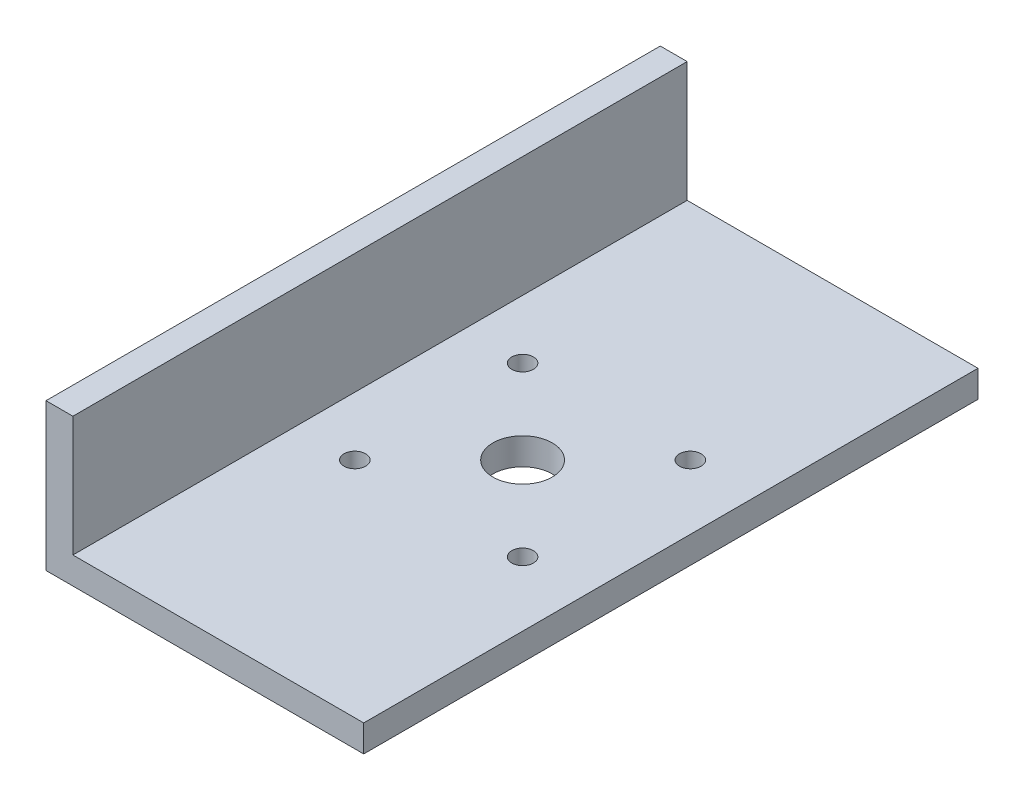
ISO-10303-21;
HEADER;
FILE_DESCRIPTION(('STEP AP214'),'2;1');
FILE_NAME('part.step','',(''),(''),'','','');
FILE_SCHEMA(('AUTOMOTIVE_DESIGN { 1 0 10303 214 1 1 1 1 }'));
ENDSEC;
DATA;
#1=APPLICATION_CONTEXT('core data for automotive mechanical design processes');
#2=APPLICATION_PROTOCOL_DEFINITION('international standard','automotive_design',2000,#1);
#3=PRODUCT_CONTEXT('',#1,'mechanical');
#4=PRODUCT('Part','Part','',(#3));
#5=PRODUCT_RELATED_PRODUCT_CATEGORY('part','',(#4));
#6=PRODUCT_DEFINITION_FORMATION('','',#4);
#7=PRODUCT_DEFINITION_CONTEXT('part definition',#1,'design');
#8=PRODUCT_DEFINITION('design','',#6,#7);
#9=PRODUCT_DEFINITION_SHAPE('','',#8);
#10=(LENGTH_UNIT() NAMED_UNIT(*) SI_UNIT(.MILLI.,.METRE.));
#11=(NAMED_UNIT(*) PLANE_ANGLE_UNIT() SI_UNIT($,.RADIAN.));
#12=(NAMED_UNIT(*) SI_UNIT($,.STERADIAN.) SOLID_ANGLE_UNIT());
#13=UNCERTAINTY_MEASURE_WITH_UNIT(LENGTH_MEASURE(1.E-05),#10,'distance_accuracy_value','');
#14=(GEOMETRIC_REPRESENTATION_CONTEXT(3) GLOBAL_UNCERTAINTY_ASSIGNED_CONTEXT((#13)) GLOBAL_UNIT_ASSIGNED_CONTEXT((#10,
#11,#12)) REPRESENTATION_CONTEXT('',''));
#15=CARTESIAN_POINT('',(0.,0.,0.));
#16=DIRECTION('',(0.,0.,1.));
#17=DIRECTION('',(1.,0.,0.));
#18=AXIS2_PLACEMENT_3D('',#15,#16,#17);
#19=CARTESIAN_POINT('',(75.,-37.5,145.));
#20=DIRECTION('',(0.,1.,0.));
#21=DIRECTION('',(0.,0.,1.));
#22=AXIS2_PLACEMENT_3D('',#19,#20,#21);
#23=PLANE('',#22);
#24=CARTESIAN_POINT('',(20.2010101267767,-37.5,52.7010101267767));
#25=DIRECTION('',(0.,1.,0.));
#26=DIRECTION('',(0.,0.,1.));
#27=AXIS2_PLACEMENT_3D('',#24,#25,#26);
#28=CIRCLE('',#27,2.54999999999999);
#29=CARTESIAN_POINT('',(20.2010101267767,-37.5,55.2510101267767));
#30=VERTEX_POINT('',#29);
#31=EDGE_CURVE('E163',#30,#30,#28,.T.);
#32=ORIENTED_EDGE('',*,*,#31,.T.);
#33=EDGE_LOOP('',(#32));
#34=FACE_BOUND('',#33,.T.);
#35=CARTESIAN_POINT('',(20.2010101267767,-37.5,92.2989898732233));
#36=DIRECTION('',(0.,1.,0.));
#37=DIRECTION('',(0.,0.,1.));
#38=AXIS2_PLACEMENT_3D('',#35,#36,#37);
#39=CIRCLE('',#38,2.54999999999999);
#40=CARTESIAN_POINT('',(20.2010101267767,-37.5,94.8489898732233));
#41=VERTEX_POINT('',#40);
#42=EDGE_CURVE('E169',#41,#41,#39,.T.);
#43=ORIENTED_EDGE('',*,*,#42,.T.);
#44=EDGE_LOOP('',(#43));
#45=FACE_BOUND('',#44,.T.);
#46=CARTESIAN_POINT('',(59.7989898732233,-37.5,92.2989898732233));
#47=DIRECTION('',(0.,1.,0.));
#48=DIRECTION('',(0.,0.,1.));
#49=AXIS2_PLACEMENT_3D('',#46,#47,#48);
#50=CIRCLE('',#49,2.55);
#51=CARTESIAN_POINT('',(59.7989898732233,-37.5,94.8489898732233));
#52=VERTEX_POINT('',#51);
#53=EDGE_CURVE('E175',#52,#52,#50,.T.);
#54=ORIENTED_EDGE('',*,*,#53,.T.);
#55=EDGE_LOOP('',(#54));
#56=FACE_BOUND('',#55,.T.);
#57=CARTESIAN_POINT('',(59.7989898732233,-37.5,52.7010101267767));
#58=DIRECTION('',(0.,1.,0.));
#59=DIRECTION('',(0.,0.,1.));
#60=AXIS2_PLACEMENT_3D('',#57,#58,#59);
#61=CIRCLE('',#60,2.55);
#62=CARTESIAN_POINT('',(59.7989898732233,-37.5,55.2510101267767));
#63=VERTEX_POINT('',#62);
#64=EDGE_CURVE('E140',#63,#63,#61,.T.);
#65=ORIENTED_EDGE('',*,*,#64,.T.);
#66=EDGE_LOOP('',(#65));
#67=FACE_BOUND('',#66,.T.);
#68=CARTESIAN_POINT('',(40.,-37.5,72.5));
#69=DIRECTION('',(0.,-1.,0.));
#70=DIRECTION('',(0.,0.,-1.));
#71=AXIS2_PLACEMENT_3D('',#68,#69,#70);
#72=CIRCLE('',#71,7.);
#73=CARTESIAN_POINT('',(40.,-37.5,65.5));
#74=VERTEX_POINT('',#73);
#75=EDGE_CURVE('E136',#74,#74,#72,.T.);
#76=ORIENTED_EDGE('',*,*,#75,.F.);
#77=EDGE_LOOP('',(#76));
#78=FACE_BOUND('',#77,.T.);
#79=DIRECTION('',(1.,0.,0.));
#80=VECTOR('',#79,1.);
#81=CARTESIAN_POINT('',(75.,-37.5,0.));
#82=LINE('',#81,#80);
#83=CARTESIAN_POINT('',(0.,-37.5,0.));
#84=VERTEX_POINT('',#83);
#85=CARTESIAN_POINT('',(75.,-37.5,0.));
#86=VERTEX_POINT('',#85);
#87=EDGE_CURVE('E118',#84,#86,#82,.T.);
#88=ORIENTED_EDGE('',*,*,#87,.T.);
#89=DIRECTION('',(0.,0.,-1.));
#90=VECTOR('',#89,1.);
#91=CARTESIAN_POINT('',(75.,-37.5,145.));
#92=LINE('',#91,#90);
#93=CARTESIAN_POINT('',(75.,-37.5,145.));
#94=VERTEX_POINT('',#93);
#95=EDGE_CURVE('E41',#94,#86,#92,.T.);
#96=ORIENTED_EDGE('',*,*,#95,.F.);
#97=DIRECTION('',(1.,0.,0.));
#98=VECTOR('',#97,1.);
#99=CARTESIAN_POINT('',(75.,-37.5,145.));
#100=LINE('',#99,#98);
#101=CARTESIAN_POINT('',(0.,-37.5,145.));
#102=VERTEX_POINT('',#101);
#103=EDGE_CURVE('E128',#102,#94,#100,.T.);
#104=ORIENTED_EDGE('',*,*,#103,.F.);
#105=DIRECTION('',(0.,0.,-1.));
#106=VECTOR('',#105,1.);
#107=CARTESIAN_POINT('',(0.,-37.5,145.));
#108=LINE('',#107,#106);
#109=EDGE_CURVE('E113',#102,#84,#108,.T.);
#110=ORIENTED_EDGE('',*,*,#109,.T.);
#111=EDGE_LOOP('',(#88,#96,#104,#110));
#112=FACE_BOUND('',#111,.T.);
#113=ADVANCED_FACE('F34',(#34,#45,#56,#67,#78,#112),#23,.F.);
#114=CARTESIAN_POINT('',(75.,-31.15,145.));
#115=DIRECTION('',(-1.,0.,0.));
#116=DIRECTION('',(0.,-1.,0.));
#117=AXIS2_PLACEMENT_3D('',#114,#115,#116);
#118=PLANE('',#117);
#119=DIRECTION('',(0.,1.,0.));
#120=VECTOR('',#119,1.);
#121=CARTESIAN_POINT('',(75.,-31.15,0.));
#122=LINE('',#121,#120);
#123=CARTESIAN_POINT('',(75.,-31.15,0.));
#124=VERTEX_POINT('',#123);
#125=EDGE_CURVE('E121',#86,#124,#122,.T.);
#126=ORIENTED_EDGE('',*,*,#125,.T.);
#127=DIRECTION('',(0.,0.,-1.));
#128=VECTOR('',#127,1.);
#129=CARTESIAN_POINT('',(75.,-31.15,145.));
#130=LINE('',#129,#128);
#131=CARTESIAN_POINT('',(75.,-31.15,145.));
#132=VERTEX_POINT('',#131);
#133=EDGE_CURVE('E132',#132,#124,#130,.T.);
#134=ORIENTED_EDGE('',*,*,#133,.F.);
#135=DIRECTION('',(0.,1.,0.));
#136=VECTOR('',#135,1.);
#137=CARTESIAN_POINT('',(75.,-31.15,145.));
#138=LINE('',#137,#136);
#139=EDGE_CURVE('E86',#94,#132,#138,.T.);
#140=ORIENTED_EDGE('',*,*,#139,.F.);
#141=ORIENTED_EDGE('',*,*,#95,.T.);
#142=EDGE_LOOP('',(#126,#134,#140,#141));
#143=FACE_BOUND('',#142,.T.);
#144=ADVANCED_FACE('F151',(#143),#118,.F.);
#145=CARTESIAN_POINT('',(6.35000000000001,-31.15,145.));
#146=DIRECTION('',(0.,-1.,0.));
#147=DIRECTION('',(0.,0.,-1.));
#148=AXIS2_PLACEMENT_3D('',#145,#146,#147);
#149=PLANE('',#148);
#150=CARTESIAN_POINT('',(20.2010101267767,-31.15,52.7010101267767));
#151=DIRECTION('',(0.,1.,0.));
#152=DIRECTION('',(0.,0.,1.));
#153=AXIS2_PLACEMENT_3D('',#150,#151,#152);
#154=CIRCLE('',#153,2.54999999999999);
#155=CARTESIAN_POINT('',(20.2010101267767,-31.15,55.2510101267767));
#156=VERTEX_POINT('',#155);
#157=EDGE_CURVE('E97',#156,#156,#154,.T.);
#158=ORIENTED_EDGE('',*,*,#157,.F.);
#159=EDGE_LOOP('',(#158));
#160=FACE_BOUND('',#159,.T.);
#161=CARTESIAN_POINT('',(20.2010101267767,-31.15,92.2989898732233));
#162=DIRECTION('',(0.,1.,0.));
#163=DIRECTION('',(0.,0.,1.));
#164=AXIS2_PLACEMENT_3D('',#161,#162,#163);
#165=CIRCLE('',#164,2.54999999999999);
#166=CARTESIAN_POINT('',(20.2010101267767,-31.15,94.8489898732233));
#167=VERTEX_POINT('',#166);
#168=EDGE_CURVE('E166',#167,#167,#165,.T.);
#169=ORIENTED_EDGE('',*,*,#168,.F.);
#170=EDGE_LOOP('',(#169));
#171=FACE_BOUND('',#170,.T.);
#172=CARTESIAN_POINT('',(59.7989898732233,-31.15,92.2989898732233));
#173=DIRECTION('',(0.,1.,0.));
#174=DIRECTION('',(0.,0.,1.));
#175=AXIS2_PLACEMENT_3D('',#172,#173,#174);
#176=CIRCLE('',#175,2.55);
#177=CARTESIAN_POINT('',(59.7989898732233,-31.15,94.8489898732233));
#178=VERTEX_POINT('',#177);
#179=EDGE_CURVE('E172',#178,#178,#176,.T.);
#180=ORIENTED_EDGE('',*,*,#179,.F.);
#181=EDGE_LOOP('',(#180));
#182=FACE_BOUND('',#181,.T.);
#183=CARTESIAN_POINT('',(59.7989898732233,-31.15,52.7010101267767));
#184=DIRECTION('',(0.,1.,0.));
#185=DIRECTION('',(0.,0.,1.));
#186=AXIS2_PLACEMENT_3D('',#183,#184,#185);
#187=CIRCLE('',#186,2.55);
#188=CARTESIAN_POINT('',(59.7989898732233,-31.15,55.2510101267767));
#189=VERTEX_POINT('',#188);
#190=EDGE_CURVE('E145',#189,#189,#187,.T.);
#191=ORIENTED_EDGE('',*,*,#190,.F.);
#192=EDGE_LOOP('',(#191));
#193=FACE_BOUND('',#192,.T.);
#194=CARTESIAN_POINT('',(40.,-31.15,72.5));
#195=DIRECTION('',(0.,-1.,0.));
#196=DIRECTION('',(0.,0.,-1.));
#197=AXIS2_PLACEMENT_3D('',#194,#195,#196);
#198=CIRCLE('',#197,7.);
#199=CARTESIAN_POINT('',(40.,-31.15,65.5));
#200=VERTEX_POINT('',#199);
#201=EDGE_CURVE('E122',#200,#200,#198,.T.);
#202=ORIENTED_EDGE('',*,*,#201,.T.);
#203=EDGE_LOOP('',(#202));
#204=FACE_BOUND('',#203,.T.);
#205=DIRECTION('',(-1.,0.,0.));
#206=VECTOR('',#205,1.);
#207=CARTESIAN_POINT('',(6.35000000000001,-31.15,0.));
#208=LINE('',#207,#206);
#209=CARTESIAN_POINT('',(6.35000000000001,-31.15,0.));
#210=VERTEX_POINT('',#209);
#211=EDGE_CURVE('E124',#124,#210,#208,.T.);
#212=ORIENTED_EDGE('',*,*,#211,.T.);
#213=DIRECTION('',(0.,0.,-1.));
#214=VECTOR('',#213,1.);
#215=CARTESIAN_POINT('',(6.35000000000001,-31.15,145.));
#216=LINE('',#215,#214);
#217=CARTESIAN_POINT('',(6.35000000000001,-31.15,145.));
#218=VERTEX_POINT('',#217);
#219=EDGE_CURVE('E130',#218,#210,#216,.T.);
#220=ORIENTED_EDGE('',*,*,#219,.F.);
#221=DIRECTION('',(-1.,0.,0.));
#222=VECTOR('',#221,1.);
#223=CARTESIAN_POINT('',(6.35000000000001,-31.15,145.));
#224=LINE('',#223,#222);
#225=EDGE_CURVE('E110',#132,#218,#224,.T.);
#226=ORIENTED_EDGE('',*,*,#225,.F.);
#227=ORIENTED_EDGE('',*,*,#133,.T.);
#228=EDGE_LOOP('',(#212,#220,#226,#227));
#229=FACE_BOUND('',#228,.T.);
#230=ADVANCED_FACE('F154',(#160,#171,#182,#193,#204,#229),#149,.F.);
#231=CARTESIAN_POINT('',(6.35000000000001,31.15,145.));
#232=DIRECTION('',(-1.,0.,0.));
#233=DIRECTION('',(0.,0.,1.));
#234=AXIS2_PLACEMENT_3D('',#231,#232,#233);
#235=PLANE('',#234);
#236=DIRECTION('',(0.,1.,0.));
#237=VECTOR('',#236,1.);
#238=CARTESIAN_POINT('',(6.35000000000001,31.15,0.));
#239=LINE('',#238,#237);
#240=CARTESIAN_POINT('',(6.35000000000001,-2.77546837767773,0.));
#241=VERTEX_POINT('',#240);
#242=EDGE_CURVE('E106',#210,#241,#239,.T.);
#243=ORIENTED_EDGE('',*,*,#242,.T.);
#244=DIRECTION('',(0.,0.,-1.));
#245=VECTOR('',#244,1.);
#246=CARTESIAN_POINT('',(6.35000000000001,-2.77546837767769,-110.059120816356));
#247=LINE('',#246,#245);
#248=CARTESIAN_POINT('',(6.35000000000001,-2.77546837767772,145.));
#249=VERTEX_POINT('',#248);
#250=EDGE_CURVE('E47',#249,#241,#247,.T.);
#251=ORIENTED_EDGE('',*,*,#250,.F.);
#252=DIRECTION('',(0.,1.,0.));
#253=VECTOR('',#252,1.);
#254=CARTESIAN_POINT('',(6.35000000000001,31.15,145.));
#255=LINE('',#254,#253);
#256=EDGE_CURVE('E104',#218,#249,#255,.T.);
#257=ORIENTED_EDGE('',*,*,#256,.F.);
#258=ORIENTED_EDGE('',*,*,#219,.T.);
#259=EDGE_LOOP('',(#243,#251,#257,#258));
#260=FACE_BOUND('',#259,.T.);
#261=ADVANCED_FACE('F102',(#260),#235,.F.);
#262=CARTESIAN_POINT('',(0.,-37.5,145.));
#263=DIRECTION('',(1.,0.,0.));
#264=DIRECTION('',(0.,0.,-1.));
#265=AXIS2_PLACEMENT_3D('',#262,#263,#264);
#266=PLANE('',#265);
#267=DIRECTION('',(0.,-1.,0.));
#268=VECTOR('',#267,1.);
#269=CARTESIAN_POINT('',(0.,-37.5,145.));
#270=LINE('',#269,#268);
#271=CARTESIAN_POINT('',(0.,-2.77546837767773,145.));
#272=VERTEX_POINT('',#271);
#273=EDGE_CURVE('E56',#272,#102,#270,.T.);
#274=ORIENTED_EDGE('',*,*,#273,.F.);
#275=DIRECTION('',(0.,0.,-1.));
#276=VECTOR('',#275,1.);
#277=CARTESIAN_POINT('',(0.,-2.77546837767773,145.));
#278=LINE('',#277,#276);
#279=CARTESIAN_POINT('',(0.,-2.77546837767771,0.));
#280=VERTEX_POINT('',#279);
#281=EDGE_CURVE('E95',#272,#280,#278,.T.);
#282=ORIENTED_EDGE('',*,*,#281,.T.);
#283=DIRECTION('',(0.,-1.,0.));
#284=VECTOR('',#283,1.);
#285=CARTESIAN_POINT('',(0.,-37.5,0.));
#286=LINE('',#285,#284);
#287=EDGE_CURVE('E78',#280,#84,#286,.T.);
#288=ORIENTED_EDGE('',*,*,#287,.T.);
#289=ORIENTED_EDGE('',*,*,#109,.F.);
#290=EDGE_LOOP('',(#274,#282,#288,#289));
#291=FACE_BOUND('',#290,.T.);
#292=ADVANCED_FACE('F158',(#291),#266,.F.);
#293=CARTESIAN_POINT('',(0.,0.,145.));
#294=DIRECTION('',(0.,0.,-1.));
#295=DIRECTION('',(-1.,0.,0.));
#296=AXIS2_PLACEMENT_3D('',#293,#294,#295);
#297=PLANE('',#296);
#298=ORIENTED_EDGE('',*,*,#256,.T.);
#299=DIRECTION('',(-1.,0.,0.));
#300=VECTOR('',#299,1.);
#301=CARTESIAN_POINT('',(0.,-2.77546837767772,145.));
#302=LINE('',#301,#300);
#303=EDGE_CURVE('E93',#249,#272,#302,.T.);
#304=ORIENTED_EDGE('',*,*,#303,.T.);
#305=ORIENTED_EDGE('',*,*,#273,.T.);
#306=ORIENTED_EDGE('',*,*,#103,.T.);
#307=ORIENTED_EDGE('',*,*,#139,.T.);
#308=ORIENTED_EDGE('',*,*,#225,.T.);
#309=EDGE_LOOP('',(#298,#304,#305,#306,#307,#308));
#310=FACE_BOUND('',#309,.T.);
#311=ADVANCED_FACE('F108',(#310),#297,.F.);
#312=CARTESIAN_POINT('',(0.,0.,0.));
#313=DIRECTION('',(0.,0.,-1.));
#314=DIRECTION('',(-1.,0.,0.));
#315=AXIS2_PLACEMENT_3D('',#312,#313,#314);
#316=PLANE('',#315);
#317=DIRECTION('',(-1.,0.,0.));
#318=VECTOR('',#317,1.);
#319=CARTESIAN_POINT('',(0.,-2.77546837767771,0.));
#320=LINE('',#319,#318);
#321=EDGE_CURVE('E11',#241,#280,#320,.T.);
#322=ORIENTED_EDGE('',*,*,#321,.F.);
#323=ORIENTED_EDGE('',*,*,#242,.F.);
#324=ORIENTED_EDGE('',*,*,#211,.F.);
#325=ORIENTED_EDGE('',*,*,#125,.F.);
#326=ORIENTED_EDGE('',*,*,#87,.F.);
#327=ORIENTED_EDGE('',*,*,#287,.F.);
#328=EDGE_LOOP('',(#322,#323,#324,#325,#326,#327));
#329=FACE_BOUND('',#328,.T.);
#330=ADVANCED_FACE('F156',(#329),#316,.T.);
#331=CARTESIAN_POINT('',(40.,-27.5,72.5));
#332=DIRECTION('',(0.,-1.,0.));
#333=DIRECTION('',(0.,0.,-1.));
#334=AXIS2_PLACEMENT_3D('',#331,#332,#333);
#335=CYLINDRICAL_SURFACE('',#334,7.);
#336=ORIENTED_EDGE('',*,*,#75,.T.);
#337=EDGE_LOOP('',(#336));
#338=FACE_BOUND('',#337,.T.);
#339=ORIENTED_EDGE('',*,*,#201,.F.);
#340=EDGE_LOOP('',(#339));
#341=FACE_BOUND('',#340,.T.);
#342=ADVANCED_FACE('F209',(#338,#341),#335,.F.);
#343=CARTESIAN_POINT('',(59.7989898732233,-41.15,52.7010101267767));
#344=DIRECTION('',(0.,1.,0.));
#345=DIRECTION('',(0.,0.,1.));
#346=AXIS2_PLACEMENT_3D('',#343,#344,#345);
#347=CYLINDRICAL_SURFACE('',#346,2.55);
#348=ORIENTED_EDGE('',*,*,#190,.T.);
#349=EDGE_LOOP('',(#348));
#350=FACE_BOUND('',#349,.T.);
#351=ORIENTED_EDGE('',*,*,#64,.F.);
#352=EDGE_LOOP('',(#351));
#353=FACE_BOUND('',#352,.T.);
#354=ADVANCED_FACE('F180',(#350,#353),#347,.F.);
#355=CARTESIAN_POINT('',(59.7989898732233,-41.15,92.2989898732233));
#356=DIRECTION('',(0.,1.,0.));
#357=DIRECTION('',(0.,0.,1.));
#358=AXIS2_PLACEMENT_3D('',#355,#356,#357);
#359=CYLINDRICAL_SURFACE('',#358,2.55);
#360=ORIENTED_EDGE('',*,*,#179,.T.);
#361=EDGE_LOOP('',(#360));
#362=FACE_BOUND('',#361,.T.);
#363=ORIENTED_EDGE('',*,*,#53,.F.);
#364=EDGE_LOOP('',(#363));
#365=FACE_BOUND('',#364,.T.);
#366=ADVANCED_FACE('F208',(#362,#365),#359,.F.);
#367=CARTESIAN_POINT('',(20.2010101267767,-41.15,92.2989898732233));
#368=DIRECTION('',(0.,1.,0.));
#369=DIRECTION('',(0.,0.,1.));
#370=AXIS2_PLACEMENT_3D('',#367,#368,#369);
#371=CYLINDRICAL_SURFACE('',#370,2.54999999999999);
#372=ORIENTED_EDGE('',*,*,#168,.T.);
#373=EDGE_LOOP('',(#372));
#374=FACE_BOUND('',#373,.T.);
#375=ORIENTED_EDGE('',*,*,#42,.F.);
#376=EDGE_LOOP('',(#375));
#377=FACE_BOUND('',#376,.T.);
#378=ADVANCED_FACE('F215',(#374,#377),#371,.F.);
#379=CARTESIAN_POINT('',(20.2010101267767,-41.15,52.7010101267767));
#380=DIRECTION('',(0.,1.,0.));
#381=DIRECTION('',(0.,0.,1.));
#382=AXIS2_PLACEMENT_3D('',#379,#380,#381);
#383=CYLINDRICAL_SURFACE('',#382,2.54999999999999);
#384=ORIENTED_EDGE('',*,*,#157,.T.);
#385=EDGE_LOOP('',(#384));
#386=FACE_BOUND('',#385,.T.);
#387=ORIENTED_EDGE('',*,*,#31,.F.);
#388=EDGE_LOOP('',(#387));
#389=FACE_BOUND('',#388,.T.);
#390=ADVANCED_FACE('F244',(#386,#389),#383,.F.);
#391=CARTESIAN_POINT('',(-3.64999999999999,-2.77546837767769,-110.059120816356));
#392=DIRECTION('',(0.,-1.,0.));
#393=DIRECTION('',(0.,0.,-1.));
#394=AXIS2_PLACEMENT_3D('',#391,#392,#393);
#395=PLANE('',#394);
#396=ORIENTED_EDGE('',*,*,#250,.T.);
#397=ORIENTED_EDGE('',*,*,#321,.T.);
#398=ORIENTED_EDGE('',*,*,#281,.F.);
#399=ORIENTED_EDGE('',*,*,#303,.F.);
#400=EDGE_LOOP('',(#396,#397,#398,#399));
#401=FACE_BOUND('',#400,.T.);
#402=ADVANCED_FACE('F94',(#401),#395,.F.);
#403=CLOSED_SHELL('',(#113,#144,#230,#261,#292,#311,#330,#342,#354,#366,#378,#390,#402));
#404=MANIFOLD_SOLID_BREP('B2',#403);
#405=ADVANCED_BREP_SHAPE_REPRESENTATION('',(#18,#404),#14);
#406=SHAPE_DEFINITION_REPRESENTATION(#9,#405);
ENDSEC;
END-ISO-10303-21;
